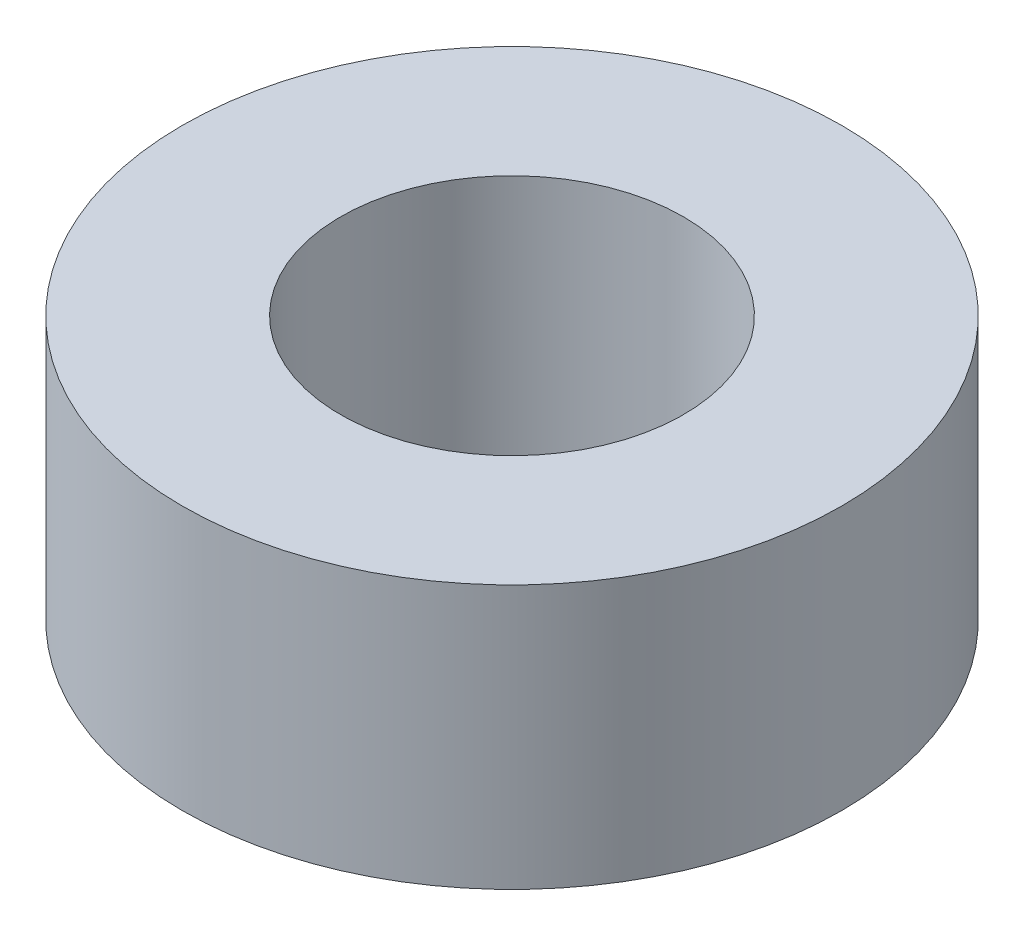
ISO-10303-21;
HEADER;
FILE_DESCRIPTION(('STEP AP214'),'2;1');
FILE_NAME('part.step','',(''),(''),'','','');
FILE_SCHEMA(('AUTOMOTIVE_DESIGN { 1 0 10303 214 1 1 1 1 }'));
ENDSEC;
DATA;
#1=APPLICATION_CONTEXT('core data for automotive mechanical design processes');
#2=APPLICATION_PROTOCOL_DEFINITION('international standard','automotive_design',2000,#1);
#3=PRODUCT_CONTEXT('',#1,'mechanical');
#4=PRODUCT('Part','Part','',(#3));
#5=PRODUCT_RELATED_PRODUCT_CATEGORY('part','',(#4));
#6=PRODUCT_DEFINITION_FORMATION('','',#4);
#7=PRODUCT_DEFINITION_CONTEXT('part definition',#1,'design');
#8=PRODUCT_DEFINITION('design','',#6,#7);
#9=PRODUCT_DEFINITION_SHAPE('','',#8);
#10=(LENGTH_UNIT() NAMED_UNIT(*) SI_UNIT(.MILLI.,.METRE.));
#11=(NAMED_UNIT(*) PLANE_ANGLE_UNIT() SI_UNIT($,.RADIAN.));
#12=(NAMED_UNIT(*) SI_UNIT($,.STERADIAN.) SOLID_ANGLE_UNIT());
#13=UNCERTAINTY_MEASURE_WITH_UNIT(LENGTH_MEASURE(1.E-05),#10,'distance_accuracy_value','');
#14=(GEOMETRIC_REPRESENTATION_CONTEXT(3) GLOBAL_UNCERTAINTY_ASSIGNED_CONTEXT((#13)) GLOBAL_UNIT_ASSIGNED_CONTEXT((#10,
#11,#12)) REPRESENTATION_CONTEXT('',''));
#15=CARTESIAN_POINT('',(0.,0.,0.));
#16=DIRECTION('',(0.,0.,1.));
#17=DIRECTION('',(1.,0.,0.));
#18=AXIS2_PLACEMENT_3D('',#15,#16,#17);
#19=CARTESIAN_POINT('',(0.,7.62,0.));
#20=DIRECTION('',(0.,1.,0.));
#21=DIRECTION('',(0.,0.,1.));
#22=AXIS2_PLACEMENT_3D('',#19,#20,#21);
#23=PLANE('',#22);
#24=CARTESIAN_POINT('',(0.,7.62,0.));
#25=DIRECTION('',(0.,1.,0.));
#26=DIRECTION('',(0.,0.,1.));
#27=AXIS2_PLACEMENT_3D('',#24,#25,#26);
#28=CIRCLE('',#27,9.525);
#29=CARTESIAN_POINT('',(0.,7.62,-9.525));
#30=VERTEX_POINT('',#29);
#31=EDGE_CURVE('E10',#30,#30,#28,.T.);
#32=ORIENTED_EDGE('',*,*,#31,.T.);
#33=EDGE_LOOP('',(#32));
#34=FACE_BOUND('',#33,.T.);
#35=CARTESIAN_POINT('',(0.,7.62,0.));
#36=DIRECTION('',(0.,1.,0.));
#37=DIRECTION('',(0.,0.,1.));
#38=AXIS2_PLACEMENT_3D('',#35,#36,#37);
#39=CIRCLE('',#38,4.953);
#40=CARTESIAN_POINT('',(0.,7.62,-4.953));
#41=VERTEX_POINT('',#40);
#42=EDGE_CURVE('E54',#41,#41,#39,.T.);
#43=ORIENTED_EDGE('',*,*,#42,.F.);
#44=EDGE_LOOP('',(#43));
#45=FACE_BOUND('',#44,.T.);
#46=ADVANCED_FACE('F41',(#34,#45),#23,.T.);
#47=CARTESIAN_POINT('',(0.,0.,0.));
#48=DIRECTION('',(0.,1.,0.));
#49=DIRECTION('',(0.,0.,1.));
#50=AXIS2_PLACEMENT_3D('',#47,#48,#49);
#51=PLANE('',#50);
#52=CARTESIAN_POINT('',(0.,0.,0.));
#53=DIRECTION('',(0.,1.,0.));
#54=DIRECTION('',(0.,0.,1.));
#55=AXIS2_PLACEMENT_3D('',#52,#53,#54);
#56=CIRCLE('',#55,9.525);
#57=CARTESIAN_POINT('',(0.,0.,-9.525));
#58=VERTEX_POINT('',#57);
#59=EDGE_CURVE('E45',#58,#58,#56,.T.);
#60=ORIENTED_EDGE('',*,*,#59,.F.);
#61=EDGE_LOOP('',(#60));
#62=FACE_BOUND('',#61,.T.);
#63=CARTESIAN_POINT('',(0.,0.,0.));
#64=DIRECTION('',(0.,1.,0.));
#65=DIRECTION('',(0.,0.,1.));
#66=AXIS2_PLACEMENT_3D('',#63,#64,#65);
#67=CIRCLE('',#66,4.953);
#68=CARTESIAN_POINT('',(0.,0.,-4.953));
#69=VERTEX_POINT('',#68);
#70=EDGE_CURVE('E56',#69,#69,#67,.T.);
#71=ORIENTED_EDGE('',*,*,#70,.T.);
#72=EDGE_LOOP('',(#71));
#73=FACE_BOUND('',#72,.T.);
#74=ADVANCED_FACE('F68',(#62,#73),#51,.F.);
#75=CARTESIAN_POINT('',(0.,7.62,0.));
#76=DIRECTION('',(0.,-1.,0.));
#77=DIRECTION('',(0.,0.,-1.));
#78=AXIS2_PLACEMENT_3D('',#75,#76,#77);
#79=CYLINDRICAL_SURFACE('',#78,9.525);
#80=CARTESIAN_POINT('',(0.,7.62,-9.525));
#81=CARTESIAN_POINT('',(0.,7.540625,-9.525));
#82=CARTESIAN_POINT('',(0.,7.46125,-9.525));
#83=CARTESIAN_POINT('',(0.,7.3025,-9.525));
#84=CARTESIAN_POINT('',(0.,7.223125,-9.525));
#85=CARTESIAN_POINT('',(0.,7.064375,-9.525));
#86=CARTESIAN_POINT('',(0.,6.985,-9.525));
#87=CARTESIAN_POINT('',(0.,6.82625,-9.525));
#88=CARTESIAN_POINT('',(0.,6.746875,-9.525));
#89=CARTESIAN_POINT('',(0.,6.588125,-9.525));
#90=CARTESIAN_POINT('',(0.,6.50875,-9.525));
#91=CARTESIAN_POINT('',(0.,6.35,-9.525));
#92=CARTESIAN_POINT('',(0.,6.270625,-9.525));
#93=CARTESIAN_POINT('',(0.,6.111875,-9.525));
#94=CARTESIAN_POINT('',(0.,6.0325,-9.525));
#95=CARTESIAN_POINT('',(0.,5.87375,-9.525));
#96=CARTESIAN_POINT('',(0.,5.794375,-9.525));
#97=CARTESIAN_POINT('',(0.,5.635625,-9.525));
#98=CARTESIAN_POINT('',(0.,5.55625,-9.525));
#99=CARTESIAN_POINT('',(0.,5.3975,-9.525));
#100=CARTESIAN_POINT('',(0.,5.318125,-9.525));
#101=CARTESIAN_POINT('',(0.,5.159375,-9.525));
#102=CARTESIAN_POINT('',(0.,5.08,-9.525));
#103=CARTESIAN_POINT('',(0.,4.92125,-9.525));
#104=CARTESIAN_POINT('',(0.,4.841875,-9.525));
#105=CARTESIAN_POINT('',(0.,4.683125,-9.525));
#106=CARTESIAN_POINT('',(0.,4.60375,-9.525));
#107=CARTESIAN_POINT('',(0.,4.445,-9.525));
#108=CARTESIAN_POINT('',(0.,4.365625,-9.525));
#109=CARTESIAN_POINT('',(0.,4.206875,-9.525));
#110=CARTESIAN_POINT('',(0.,4.1275,-9.525));
#111=CARTESIAN_POINT('',(0.,3.96875,-9.525));
#112=CARTESIAN_POINT('',(0.,3.889375,-9.525));
#113=CARTESIAN_POINT('',(0.,3.730625,-9.525));
#114=CARTESIAN_POINT('',(0.,3.65125,-9.525));
#115=CARTESIAN_POINT('',(0.,3.4925,-9.525));
#116=CARTESIAN_POINT('',(0.,3.413125,-9.525));
#117=CARTESIAN_POINT('',(0.,3.254375,-9.525));
#118=CARTESIAN_POINT('',(0.,3.175,-9.525));
#119=CARTESIAN_POINT('',(0.,3.01625,-9.525));
#120=CARTESIAN_POINT('',(0.,2.936875,-9.525));
#121=CARTESIAN_POINT('',(0.,2.778125,-9.525));
#122=CARTESIAN_POINT('',(0.,2.69875,-9.525));
#123=CARTESIAN_POINT('',(0.,2.54,-9.525));
#124=CARTESIAN_POINT('',(0.,2.460625,-9.525));
#125=CARTESIAN_POINT('',(0.,2.301875,-9.525));
#126=CARTESIAN_POINT('',(0.,2.2225,-9.525));
#127=CARTESIAN_POINT('',(0.,2.06375,-9.525));
#128=CARTESIAN_POINT('',(0.,1.984375,-9.525));
#129=CARTESIAN_POINT('',(0.,1.825625,-9.525));
#130=CARTESIAN_POINT('',(0.,1.74625,-9.525));
#131=CARTESIAN_POINT('',(0.,1.5875,-9.525));
#132=CARTESIAN_POINT('',(0.,1.508125,-9.525));
#133=CARTESIAN_POINT('',(0.,1.349375,-9.525));
#134=CARTESIAN_POINT('',(0.,1.27,-9.525));
#135=CARTESIAN_POINT('',(0.,1.11125,-9.525));
#136=CARTESIAN_POINT('',(0.,1.031875,-9.525));
#137=CARTESIAN_POINT('',(0.,0.873125,-9.525));
#138=CARTESIAN_POINT('',(0.,0.79375,-9.525));
#139=CARTESIAN_POINT('',(0.,0.635,-9.525));
#140=CARTESIAN_POINT('',(0.,0.555625,-9.525));
#141=CARTESIAN_POINT('',(0.,0.396875,-9.525));
#142=CARTESIAN_POINT('',(0.,0.3175,-9.525));
#143=CARTESIAN_POINT('',(0.,0.15875,-9.525));
#144=CARTESIAN_POINT('',(0.,0.0793749999999999,-9.525));
#145=CARTESIAN_POINT('',(0.,0.,-9.525));
#146=B_SPLINE_CURVE_WITH_KNOTS('',3,(#80,#81,#82,#83,#84,#85,#86,#87,#88,#89,#90,#91,#92,#93,
#94,#95,#96,#97,#98,#99,#100,#101,#102,#103,#104,#105,#106,#107,#108,#109,#110,#111,#112,#113,
#114,#115,#116,#117,#118,#119,#120,#121,#122,#123,#124,#125,#126,#127,#128,#129,#130,#131,#132,
#133,#134,#135,#136,#137,#138,#139,#140,#141,#142,#143,#144,#145),.UNSPECIFIED.,.F.,.F.,(4,2,2,
2,2,2,2,2,2,2,2,2,2,2,2,2,2,2,2,2,2,2,2,2,2,2,2,2,2,2,2,2,4),(0.,0.238125,0.476249999999999,
0.714375,0.952499999999999,1.190625,1.42875,1.666875,1.905,2.143125,2.38125,2.619375,2.8575,
3.095625,3.33375,3.571875,3.81,4.048125,4.28625,4.524375,4.7625,5.000625,5.23875,5.476875,5.715,
5.953125,6.19125,6.429375,6.6675,6.905625,7.14375,7.381875,7.62),.UNSPECIFIED.);
#147=EDGE_CURVE('BSEAM43',#30,#58,#146,.T.);
#148=ORIENTED_EDGE('',*,*,#31,.F.);
#149=ORIENTED_EDGE('',*,*,#59,.T.);
#150=ORIENTED_EDGE('',*,*,#147,.T.);
#151=ORIENTED_EDGE('',*,*,#147,.F.);
#152=EDGE_LOOP('',(#148,#150,#149,#151));
#153=FACE_BOUND('',#152,.T.);
#154=ADVANCED_FACE('F43',(#153),#79,.T.);
#155=CARTESIAN_POINT('',(0.,7.62,0.));
#156=DIRECTION('',(0.,-1.,0.));
#157=DIRECTION('',(0.,0.,-1.));
#158=AXIS2_PLACEMENT_3D('',#155,#156,#157);
#159=CYLINDRICAL_SURFACE('',#158,4.953);
#160=CARTESIAN_POINT('',(0.,7.62,-4.953));
#161=CARTESIAN_POINT('',(0.,7.540625,-4.953));
#162=CARTESIAN_POINT('',(0.,7.46125,-4.953));
#163=CARTESIAN_POINT('',(0.,7.3025,-4.953));
#164=CARTESIAN_POINT('',(0.,7.223125,-4.953));
#165=CARTESIAN_POINT('',(0.,7.064375,-4.953));
#166=CARTESIAN_POINT('',(0.,6.985,-4.953));
#167=CARTESIAN_POINT('',(0.,6.82625,-4.953));
#168=CARTESIAN_POINT('',(0.,6.746875,-4.953));
#169=CARTESIAN_POINT('',(0.,6.588125,-4.953));
#170=CARTESIAN_POINT('',(0.,6.50875,-4.953));
#171=CARTESIAN_POINT('',(0.,6.35,-4.953));
#172=CARTESIAN_POINT('',(0.,6.270625,-4.953));
#173=CARTESIAN_POINT('',(0.,6.111875,-4.953));
#174=CARTESIAN_POINT('',(0.,6.0325,-4.953));
#175=CARTESIAN_POINT('',(0.,5.87375,-4.953));
#176=CARTESIAN_POINT('',(0.,5.794375,-4.953));
#177=CARTESIAN_POINT('',(0.,5.635625,-4.953));
#178=CARTESIAN_POINT('',(0.,5.55625,-4.953));
#179=CARTESIAN_POINT('',(0.,5.3975,-4.953));
#180=CARTESIAN_POINT('',(0.,5.318125,-4.953));
#181=CARTESIAN_POINT('',(0.,5.159375,-4.953));
#182=CARTESIAN_POINT('',(0.,5.08,-4.953));
#183=CARTESIAN_POINT('',(0.,4.92125,-4.953));
#184=CARTESIAN_POINT('',(0.,4.841875,-4.953));
#185=CARTESIAN_POINT('',(0.,4.683125,-4.953));
#186=CARTESIAN_POINT('',(0.,4.60375,-4.953));
#187=CARTESIAN_POINT('',(0.,4.445,-4.953));
#188=CARTESIAN_POINT('',(0.,4.365625,-4.953));
#189=CARTESIAN_POINT('',(0.,4.206875,-4.953));
#190=CARTESIAN_POINT('',(0.,4.1275,-4.953));
#191=CARTESIAN_POINT('',(0.,3.96875,-4.953));
#192=CARTESIAN_POINT('',(0.,3.889375,-4.953));
#193=CARTESIAN_POINT('',(0.,3.730625,-4.953));
#194=CARTESIAN_POINT('',(0.,3.65125,-4.953));
#195=CARTESIAN_POINT('',(0.,3.4925,-4.953));
#196=CARTESIAN_POINT('',(0.,3.413125,-4.953));
#197=CARTESIAN_POINT('',(0.,3.254375,-4.953));
#198=CARTESIAN_POINT('',(0.,3.175,-4.953));
#199=CARTESIAN_POINT('',(0.,3.01625,-4.953));
#200=CARTESIAN_POINT('',(0.,2.936875,-4.953));
#201=CARTESIAN_POINT('',(0.,2.778125,-4.953));
#202=CARTESIAN_POINT('',(0.,2.69875,-4.953));
#203=CARTESIAN_POINT('',(0.,2.54,-4.953));
#204=CARTESIAN_POINT('',(0.,2.460625,-4.953));
#205=CARTESIAN_POINT('',(0.,2.301875,-4.953));
#206=CARTESIAN_POINT('',(0.,2.2225,-4.953));
#207=CARTESIAN_POINT('',(0.,2.06375,-4.953));
#208=CARTESIAN_POINT('',(0.,1.984375,-4.953));
#209=CARTESIAN_POINT('',(0.,1.825625,-4.953));
#210=CARTESIAN_POINT('',(0.,1.74625,-4.953));
#211=CARTESIAN_POINT('',(0.,1.5875,-4.953));
#212=CARTESIAN_POINT('',(0.,1.508125,-4.953));
#213=CARTESIAN_POINT('',(0.,1.349375,-4.953));
#214=CARTESIAN_POINT('',(0.,1.27,-4.953));
#215=CARTESIAN_POINT('',(0.,1.11125,-4.953));
#216=CARTESIAN_POINT('',(0.,1.031875,-4.953));
#217=CARTESIAN_POINT('',(0.,0.873125,-4.953));
#218=CARTESIAN_POINT('',(0.,0.79375,-4.953));
#219=CARTESIAN_POINT('',(0.,0.635,-4.953));
#220=CARTESIAN_POINT('',(0.,0.555625,-4.953));
#221=CARTESIAN_POINT('',(0.,0.396875,-4.953));
#222=CARTESIAN_POINT('',(0.,0.3175,-4.953));
#223=CARTESIAN_POINT('',(0.,0.15875,-4.953));
#224=CARTESIAN_POINT('',(0.,0.0793749999999999,-4.953));
#225=CARTESIAN_POINT('',(0.,0.,-4.953));
#226=B_SPLINE_CURVE_WITH_KNOTS('',3,(#160,#161,#162,#163,#164,#165,#166,#167,#168,#169,#170,
#171,#172,#173,#174,#175,#176,#177,#178,#179,#180,#181,#182,#183,#184,#185,#186,#187,#188,#189,
#190,#191,#192,#193,#194,#195,#196,#197,#198,#199,#200,#201,#202,#203,#204,#205,#206,#207,#208,
#209,#210,#211,#212,#213,#214,#215,#216,#217,#218,#219,#220,#221,#222,#223,#224,#225),
.UNSPECIFIED.,.F.,.F.,(4,2,2,2,2,2,2,2,2,2,2,2,2,2,2,2,2,2,2,2,2,2,2,2,2,2,2,2,2,2,2,2,4),(0.,
0.238125,0.476249999999999,0.714375,0.952499999999999,1.190625,1.42875,1.666875,1.905,2.143125,
2.38125,2.619375,2.8575,3.095625,3.33375,3.571875,3.81,4.048125,4.28625,4.524375,4.7625,
5.000625,5.23875,5.476875,5.715,5.953125,6.19125,6.429375,6.6675,6.905625,7.14375,7.381875,
7.62),.UNSPECIFIED.);
#227=EDGE_CURVE('BSEAM64',#41,#69,#226,.T.);
#228=ORIENTED_EDGE('',*,*,#42,.T.);
#229=ORIENTED_EDGE('',*,*,#70,.F.);
#230=ORIENTED_EDGE('',*,*,#227,.T.);
#231=ORIENTED_EDGE('',*,*,#227,.F.);
#232=EDGE_LOOP('',(#228,#230,#229,#231));
#233=FACE_BOUND('',#232,.T.);
#234=ADVANCED_FACE('F64',(#233),#159,.F.);
#235=CLOSED_SHELL('',(#46,#74,#154,#234));
#236=MANIFOLD_SOLID_BREP('B2',#235);
#237=ADVANCED_BREP_SHAPE_REPRESENTATION('',(#18,#236),#14);
#238=SHAPE_DEFINITION_REPRESENTATION(#9,#237);
ENDSEC;
END-ISO-10303-21;
